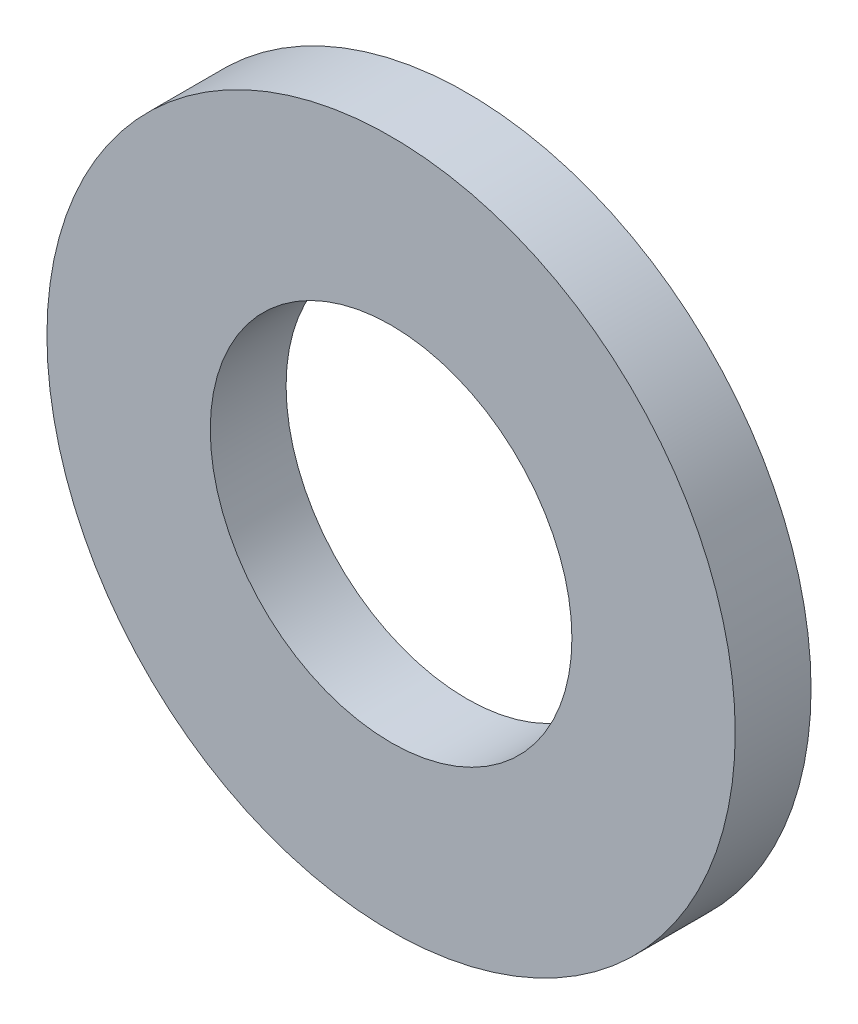
ISO-10303-21;
HEADER;
FILE_DESCRIPTION(('STEP AP214'),'2;1');
FILE_NAME('part.step','',(''),(''),'','','');
FILE_SCHEMA(('AUTOMOTIVE_DESIGN { 1 0 10303 214 1 1 1 1 }'));
ENDSEC;
DATA;
#1=APPLICATION_CONTEXT('core data for automotive mechanical design processes');
#2=APPLICATION_PROTOCOL_DEFINITION('international standard','automotive_design',2000,#1);
#3=PRODUCT_CONTEXT('',#1,'mechanical');
#4=PRODUCT('Part','Part','',(#3));
#5=PRODUCT_RELATED_PRODUCT_CATEGORY('part','',(#4));
#6=PRODUCT_DEFINITION_FORMATION('','',#4);
#7=PRODUCT_DEFINITION_CONTEXT('part definition',#1,'design');
#8=PRODUCT_DEFINITION('design','',#6,#7);
#9=PRODUCT_DEFINITION_SHAPE('','',#8);
#10=(LENGTH_UNIT() NAMED_UNIT(*) SI_UNIT(.MILLI.,.METRE.));
#11=(NAMED_UNIT(*) PLANE_ANGLE_UNIT() SI_UNIT($,.RADIAN.));
#12=(NAMED_UNIT(*) SI_UNIT($,.STERADIAN.) SOLID_ANGLE_UNIT());
#13=UNCERTAINTY_MEASURE_WITH_UNIT(LENGTH_MEASURE(1.E-05),#10,'distance_accuracy_value','');
#14=(GEOMETRIC_REPRESENTATION_CONTEXT(3) GLOBAL_UNCERTAINTY_ASSIGNED_CONTEXT((#13)) GLOBAL_UNIT_ASSIGNED_CONTEXT((#10,
#11,#12)) REPRESENTATION_CONTEXT('',''));
#15=CARTESIAN_POINT('',(0.,0.,0.));
#16=DIRECTION('',(0.,0.,1.));
#17=DIRECTION('',(1.,0.,0.));
#18=AXIS2_PLACEMENT_3D('',#15,#16,#17);
#19=CARTESIAN_POINT('',(-12.5866678912036,-14.4100664211806,0.));
#20=DIRECTION('',(0.,0.,1.));
#21=DIRECTION('',(1.,0.,0.));
#22=AXIS2_PLACEMENT_3D('',#19,#20,#21);
#23=PLANE('',#22);
#24=CARTESIAN_POINT('',(-12.5866678912036,-14.4100664211806,0.));
#25=DIRECTION('',(0.,0.,1.));
#26=DIRECTION('',(1.,0.,0.));
#27=AXIS2_PLACEMENT_3D('',#24,#25,#26);
#28=CIRCLE('',#27,5.9);
#29=CARTESIAN_POINT('',(-6.6866678912036,-14.4100664211806,0.));
#30=VERTEX_POINT('',#29);
#31=EDGE_CURVE('E10',#30,#30,#28,.T.);
#32=ORIENTED_EDGE('',*,*,#31,.F.);
#33=EDGE_LOOP('',(#32));
#34=FACE_BOUND('',#33,.T.);
#35=CARTESIAN_POINT('',(-12.5866678912036,-14.4100664211806,0.));
#36=DIRECTION('',(0.,0.,1.));
#37=DIRECTION('',(1.,0.,0.));
#38=AXIS2_PLACEMENT_3D('',#35,#36,#37);
#39=CIRCLE('',#38,3.1);
#40=CARTESIAN_POINT('',(-9.4866678912036,-14.4100664211806,0.));
#41=VERTEX_POINT('',#40);
#42=EDGE_CURVE('E49',#41,#41,#39,.T.);
#43=ORIENTED_EDGE('',*,*,#42,.T.);
#44=EDGE_LOOP('',(#43));
#45=FACE_BOUND('',#44,.T.);
#46=ADVANCED_FACE('F16',(#34,#45),#23,.F.);
#47=CARTESIAN_POINT('',(-12.5866678912036,-14.4100664211806,1.3));
#48=DIRECTION('',(0.,0.,1.));
#49=DIRECTION('',(1.,0.,0.));
#50=AXIS2_PLACEMENT_3D('',#47,#48,#49);
#51=PLANE('',#50);
#52=CARTESIAN_POINT('',(-12.5866678912036,-14.4100664211806,1.3));
#53=DIRECTION('',(0.,0.,1.));
#54=DIRECTION('',(1.,0.,0.));
#55=AXIS2_PLACEMENT_3D('',#52,#53,#54);
#56=CIRCLE('',#55,5.9);
#57=CARTESIAN_POINT('',(-6.6866678912036,-14.4100664211806,1.3));
#58=VERTEX_POINT('',#57);
#59=EDGE_CURVE('E25',#58,#58,#56,.T.);
#60=ORIENTED_EDGE('',*,*,#59,.T.);
#61=EDGE_LOOP('',(#60));
#62=FACE_BOUND('',#61,.T.);
#63=CARTESIAN_POINT('',(-12.5866678912036,-14.4100664211806,1.3));
#64=DIRECTION('',(0.,0.,1.));
#65=DIRECTION('',(1.,0.,0.));
#66=AXIS2_PLACEMENT_3D('',#63,#64,#65);
#67=CIRCLE('',#66,3.1);
#68=CARTESIAN_POINT('',(-9.4866678912036,-14.4100664211806,1.3));
#69=VERTEX_POINT('',#68);
#70=EDGE_CURVE('E45',#69,#69,#67,.T.);
#71=ORIENTED_EDGE('',*,*,#70,.F.);
#72=EDGE_LOOP('',(#71));
#73=FACE_BOUND('',#72,.T.);
#74=ADVANCED_FACE('F61',(#62,#73),#51,.T.);
#75=CARTESIAN_POINT('',(-12.5866678912036,-14.4100664211806,1.3));
#76=DIRECTION('',(0.,0.,-1.));
#77=DIRECTION('',(-1.,0.,0.));
#78=AXIS2_PLACEMENT_3D('',#75,#76,#77);
#79=CYLINDRICAL_SURFACE('',#78,5.9);
#80=ORIENTED_EDGE('',*,*,#31,.T.);
#81=EDGE_LOOP('',(#80));
#82=FACE_BOUND('',#81,.T.);
#83=ORIENTED_EDGE('',*,*,#59,.F.);
#84=EDGE_LOOP('',(#83));
#85=FACE_BOUND('',#84,.T.);
#86=ADVANCED_FACE('F63',(#82,#85),#79,.T.);
#87=CARTESIAN_POINT('',(-12.5866678912036,-14.4100664211806,1.3));
#88=DIRECTION('',(0.,0.,-1.));
#89=DIRECTION('',(-1.,0.,0.));
#90=AXIS2_PLACEMENT_3D('',#87,#88,#89);
#91=CYLINDRICAL_SURFACE('',#90,3.1);
#92=ORIENTED_EDGE('',*,*,#42,.F.);
#93=EDGE_LOOP('',(#92));
#94=FACE_BOUND('',#93,.T.);
#95=ORIENTED_EDGE('',*,*,#70,.T.);
#96=EDGE_LOOP('',(#95));
#97=FACE_BOUND('',#96,.T.);
#98=ADVANCED_FACE('F46',(#94,#97),#91,.F.);
#99=CLOSED_SHELL('',(#46,#74,#86,#98));
#100=MANIFOLD_SOLID_BREP('B1',#99);
#101=ADVANCED_BREP_SHAPE_REPRESENTATION('',(#18,#100),#14);
#102=SHAPE_DEFINITION_REPRESENTATION(#9,#101);
ENDSEC;
END-ISO-10303-21;
